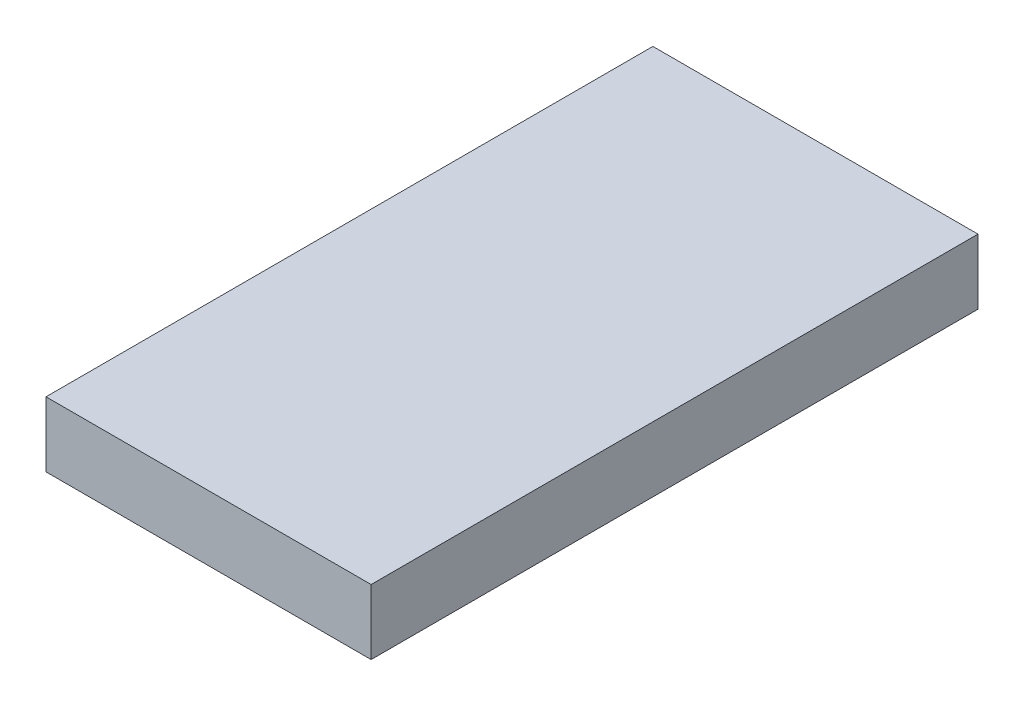
ISO-10303-21;
HEADER;
FILE_DESCRIPTION(('STEP AP214'),'2;1');
FILE_NAME('part.step','',(''),(''),'','','');
FILE_SCHEMA(('AUTOMOTIVE_DESIGN { 1 0 10303 214 1 1 1 1 }'));
ENDSEC;
DATA;
#1=APPLICATION_CONTEXT('core data for automotive mechanical design processes');
#2=APPLICATION_PROTOCOL_DEFINITION('international standard','automotive_design',2000,#1);
#3=PRODUCT_CONTEXT('',#1,'mechanical');
#4=PRODUCT('Part','Part','',(#3));
#5=PRODUCT_RELATED_PRODUCT_CATEGORY('part','',(#4));
#6=PRODUCT_DEFINITION_FORMATION('','',#4);
#7=PRODUCT_DEFINITION_CONTEXT('part definition',#1,'design');
#8=PRODUCT_DEFINITION('design','',#6,#7);
#9=PRODUCT_DEFINITION_SHAPE('','',#8);
#10=(LENGTH_UNIT() NAMED_UNIT(*) SI_UNIT(.MILLI.,.METRE.));
#11=(NAMED_UNIT(*) PLANE_ANGLE_UNIT() SI_UNIT($,.RADIAN.));
#12=(NAMED_UNIT(*) SI_UNIT($,.STERADIAN.) SOLID_ANGLE_UNIT());
#13=UNCERTAINTY_MEASURE_WITH_UNIT(LENGTH_MEASURE(1.E-05),#10,'distance_accuracy_value','');
#14=(GEOMETRIC_REPRESENTATION_CONTEXT(3) GLOBAL_UNCERTAINTY_ASSIGNED_CONTEXT((#13)) GLOBAL_UNIT_ASSIGNED_CONTEXT((#10,
#11,#12)) REPRESENTATION_CONTEXT('',''));
#15=CARTESIAN_POINT('',(0.,0.,0.));
#16=DIRECTION('',(0.,0.,1.));
#17=DIRECTION('',(1.,0.,0.));
#18=AXIS2_PLACEMENT_3D('',#15,#16,#17);
#19=CARTESIAN_POINT('',(0.,3.,0.));
#20=DIRECTION('',(1.,0.,0.));
#21=DIRECTION('',(0.,0.,-1.));
#22=AXIS2_PLACEMENT_3D('',#19,#20,#21);
#23=PLANE('',#22);
#24=DIRECTION('',(0.,0.,1.));
#25=VECTOR('',#24,1.);
#26=CARTESIAN_POINT('',(0.,0.,0.));
#27=LINE('',#26,#25);
#28=CARTESIAN_POINT('',(0.,0.,-28.));
#29=VERTEX_POINT('',#28);
#30=CARTESIAN_POINT('',(0.,0.,0.));
#31=VERTEX_POINT('',#30);
#32=EDGE_CURVE('E96',#29,#31,#27,.T.);
#33=ORIENTED_EDGE('',*,*,#32,.T.);
#34=DIRECTION('',(0.,-1.,0.));
#35=VECTOR('',#34,1.);
#36=CARTESIAN_POINT('',(0.,3.,0.));
#37=LINE('',#36,#35);
#38=CARTESIAN_POINT('',(0.,3.,0.));
#39=VERTEX_POINT('',#38);
#40=EDGE_CURVE('E11',#39,#31,#37,.T.);
#41=ORIENTED_EDGE('',*,*,#40,.F.);
#42=DIRECTION('',(0.,0.,1.));
#43=VECTOR('',#42,1.);
#44=CARTESIAN_POINT('',(0.,3.,0.));
#45=LINE('',#44,#43);
#46=CARTESIAN_POINT('',(0.,3.,-28.));
#47=VERTEX_POINT('',#46);
#48=EDGE_CURVE('E84',#47,#39,#45,.T.);
#49=ORIENTED_EDGE('',*,*,#48,.F.);
#50=DIRECTION('',(0.,-1.,0.));
#51=VECTOR('',#50,1.);
#52=CARTESIAN_POINT('',(0.,3.,-28.));
#53=LINE('',#52,#51);
#54=EDGE_CURVE('E92',#47,#29,#53,.T.);
#55=ORIENTED_EDGE('',*,*,#54,.T.);
#56=EDGE_LOOP('',(#33,#41,#49,#55));
#57=FACE_BOUND('',#56,.T.);
#58=ADVANCED_FACE('F33',(#57),#23,.F.);
#59=CARTESIAN_POINT('',(0.,3.,0.));
#60=DIRECTION('',(0.,0.,-1.));
#61=DIRECTION('',(-1.,0.,0.));
#62=AXIS2_PLACEMENT_3D('',#59,#60,#61);
#63=PLANE('',#62);
#64=DIRECTION('',(1.,0.,0.));
#65=VECTOR('',#64,1.);
#66=CARTESIAN_POINT('',(0.,0.,0.));
#67=LINE('',#66,#65);
#68=CARTESIAN_POINT('',(15.,0.,0.));
#69=VERTEX_POINT('',#68);
#70=EDGE_CURVE('E88',#31,#69,#67,.T.);
#71=ORIENTED_EDGE('',*,*,#70,.T.);
#72=DIRECTION('',(0.,-1.,0.));
#73=VECTOR('',#72,1.);
#74=CARTESIAN_POINT('',(15.,3.,0.));
#75=LINE('',#74,#73);
#76=CARTESIAN_POINT('',(15.,3.,0.));
#77=VERTEX_POINT('',#76);
#78=EDGE_CURVE('E41',#77,#69,#75,.T.);
#79=ORIENTED_EDGE('',*,*,#78,.F.);
#80=DIRECTION('',(1.,0.,0.));
#81=VECTOR('',#80,1.);
#82=CARTESIAN_POINT('',(0.,3.,0.));
#83=LINE('',#82,#81);
#84=EDGE_CURVE('E79',#39,#77,#83,.T.);
#85=ORIENTED_EDGE('',*,*,#84,.F.);
#86=ORIENTED_EDGE('',*,*,#40,.T.);
#87=EDGE_LOOP('',(#71,#79,#85,#86));
#88=FACE_BOUND('',#87,.T.);
#89=ADVANCED_FACE('F87',(#88),#63,.F.);
#90=CARTESIAN_POINT('',(15.,3.,0.));
#91=DIRECTION('',(-1.,0.,0.));
#92=DIRECTION('',(0.,0.,1.));
#93=AXIS2_PLACEMENT_3D('',#90,#91,#92);
#94=PLANE('',#93);
#95=DIRECTION('',(0.,0.,-1.));
#96=VECTOR('',#95,1.);
#97=CARTESIAN_POINT('',(15.,0.,0.));
#98=LINE('',#97,#96);
#99=CARTESIAN_POINT('',(15.,0.,-28.));
#100=VERTEX_POINT('',#99);
#101=EDGE_CURVE('E66',#69,#100,#98,.T.);
#102=ORIENTED_EDGE('',*,*,#101,.T.);
#103=DIRECTION('',(0.,-1.,0.));
#104=VECTOR('',#103,1.);
#105=CARTESIAN_POINT('',(15.,3.,-28.));
#106=LINE('',#105,#104);
#107=CARTESIAN_POINT('',(15.,3.,-28.));
#108=VERTEX_POINT('',#107);
#109=EDGE_CURVE('E89',#108,#100,#106,.T.);
#110=ORIENTED_EDGE('',*,*,#109,.F.);
#111=DIRECTION('',(0.,0.,-1.));
#112=VECTOR('',#111,1.);
#113=CARTESIAN_POINT('',(15.,3.,0.));
#114=LINE('',#113,#112);
#115=EDGE_CURVE('E82',#77,#108,#114,.T.);
#116=ORIENTED_EDGE('',*,*,#115,.F.);
#117=ORIENTED_EDGE('',*,*,#78,.T.);
#118=EDGE_LOOP('',(#102,#110,#116,#117));
#119=FACE_BOUND('',#118,.T.);
#120=ADVANCED_FACE('F90',(#119),#94,.F.);
#121=CARTESIAN_POINT('',(0.,3.,-28.));
#122=DIRECTION('',(0.,0.,1.));
#123=DIRECTION('',(1.,0.,0.));
#124=AXIS2_PLACEMENT_3D('',#121,#122,#123);
#125=PLANE('',#124);
#126=DIRECTION('',(-1.,0.,0.));
#127=VECTOR('',#126,1.);
#128=CARTESIAN_POINT('',(0.,0.,-28.));
#129=LINE('',#128,#127);
#130=EDGE_CURVE('E72',#100,#29,#129,.T.);
#131=ORIENTED_EDGE('',*,*,#130,.T.);
#132=ORIENTED_EDGE('',*,*,#54,.F.);
#133=DIRECTION('',(-1.,0.,0.));
#134=VECTOR('',#133,1.);
#135=CARTESIAN_POINT('',(0.,3.,-28.));
#136=LINE('',#135,#134);
#137=EDGE_CURVE('E49',#108,#47,#136,.T.);
#138=ORIENTED_EDGE('',*,*,#137,.F.);
#139=ORIENTED_EDGE('',*,*,#109,.T.);
#140=EDGE_LOOP('',(#131,#132,#138,#139));
#141=FACE_BOUND('',#140,.T.);
#142=ADVANCED_FACE('F103',(#141),#125,.F.);
#143=CARTESIAN_POINT('',(0.,3.,0.));
#144=DIRECTION('',(0.,-1.,0.));
#145=DIRECTION('',(0.,0.,-1.));
#146=AXIS2_PLACEMENT_3D('',#143,#144,#145);
#147=PLANE('',#146);
#148=ORIENTED_EDGE('',*,*,#48,.T.);
#149=ORIENTED_EDGE('',*,*,#84,.T.);
#150=ORIENTED_EDGE('',*,*,#115,.T.);
#151=ORIENTED_EDGE('',*,*,#137,.T.);
#152=EDGE_LOOP('',(#148,#149,#150,#151));
#153=FACE_BOUND('',#152,.T.);
#154=ADVANCED_FACE('F80',(#153),#147,.F.);
#155=CARTESIAN_POINT('',(0.,0.,0.));
#156=DIRECTION('',(0.,-1.,0.));
#157=DIRECTION('',(0.,0.,-1.));
#158=AXIS2_PLACEMENT_3D('',#155,#156,#157);
#159=PLANE('',#158);
#160=ORIENTED_EDGE('',*,*,#32,.F.);
#161=ORIENTED_EDGE('',*,*,#130,.F.);
#162=ORIENTED_EDGE('',*,*,#101,.F.);
#163=ORIENTED_EDGE('',*,*,#70,.F.);
#164=EDGE_LOOP('',(#160,#161,#162,#163));
#165=FACE_BOUND('',#164,.T.);
#166=ADVANCED_FACE('F106',(#165),#159,.T.);
#167=CLOSED_SHELL('',(#58,#89,#120,#142,#154,#166));
#168=MANIFOLD_SOLID_BREP('B2',#167);
#169=ADVANCED_BREP_SHAPE_REPRESENTATION('',(#18,#168),#14);
#170=SHAPE_DEFINITION_REPRESENTATION(#9,#169);
ENDSEC;
END-ISO-10303-21;
